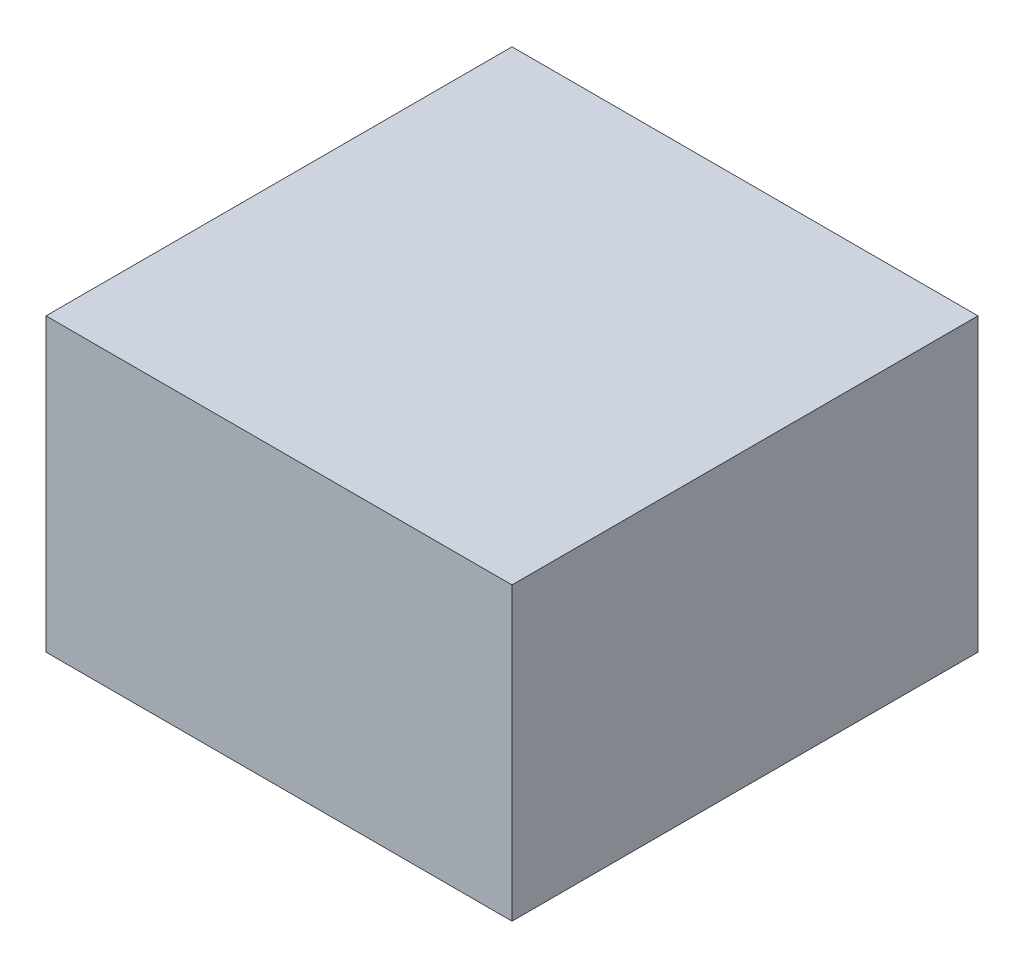
ISO-10303-21;
HEADER;
FILE_DESCRIPTION(('STEP AP214'),'2;1');
FILE_NAME('part.step','',(''),(''),'','','');
FILE_SCHEMA(('AUTOMOTIVE_DESIGN { 1 0 10303 214 1 1 1 1 }'));
ENDSEC;
DATA;
#1=APPLICATION_CONTEXT('core data for automotive mechanical design processes');
#2=APPLICATION_PROTOCOL_DEFINITION('international standard','automotive_design',2000,#1);
#3=PRODUCT_CONTEXT('',#1,'mechanical');
#4=PRODUCT('Part','Part','',(#3));
#5=PRODUCT_RELATED_PRODUCT_CATEGORY('part','',(#4));
#6=PRODUCT_DEFINITION_FORMATION('','',#4);
#7=PRODUCT_DEFINITION_CONTEXT('part definition',#1,'design');
#8=PRODUCT_DEFINITION('design','',#6,#7);
#9=PRODUCT_DEFINITION_SHAPE('','',#8);
#10=(LENGTH_UNIT() NAMED_UNIT(*) SI_UNIT(.MILLI.,.METRE.));
#11=(NAMED_UNIT(*) PLANE_ANGLE_UNIT() SI_UNIT($,.RADIAN.));
#12=(NAMED_UNIT(*) SI_UNIT($,.STERADIAN.) SOLID_ANGLE_UNIT());
#13=UNCERTAINTY_MEASURE_WITH_UNIT(LENGTH_MEASURE(1.E-05),#10,'distance_accuracy_value','');
#14=(GEOMETRIC_REPRESENTATION_CONTEXT(3) GLOBAL_UNCERTAINTY_ASSIGNED_CONTEXT((#13)) GLOBAL_UNIT_ASSIGNED_CONTEXT((#10,
#11,#12)) REPRESENTATION_CONTEXT('',''));
#15=CARTESIAN_POINT('',(0.,0.,0.));
#16=DIRECTION('',(0.,0.,1.));
#17=DIRECTION('',(1.,0.,0.));
#18=AXIS2_PLACEMENT_3D('',#15,#16,#17);
#19=CARTESIAN_POINT('',(101.6,127.,-101.6));
#20=DIRECTION('',(-1.,0.,0.));
#21=DIRECTION('',(0.,0.,1.));
#22=AXIS2_PLACEMENT_3D('',#19,#20,#21);
#23=PLANE('',#22);
#24=DIRECTION('',(0.,0.,-1.));
#25=VECTOR('',#24,1.);
#26=CARTESIAN_POINT('',(101.6,0.,-101.6));
#27=LINE('',#26,#25);
#28=CARTESIAN_POINT('',(101.6,0.,101.6));
#29=VERTEX_POINT('',#28);
#30=CARTESIAN_POINT('',(101.6,0.,-101.6));
#31=VERTEX_POINT('',#30);
#32=EDGE_CURVE('E107',#29,#31,#27,.T.);
#33=ORIENTED_EDGE('',*,*,#32,.T.);
#34=DIRECTION('',(0.,-1.,0.));
#35=VECTOR('',#34,1.);
#36=CARTESIAN_POINT('',(101.6,127.,-101.6));
#37=LINE('',#36,#35);
#38=CARTESIAN_POINT('',(101.6,127.,-101.6));
#39=VERTEX_POINT('',#38);
#40=EDGE_CURVE('E11',#39,#31,#37,.T.);
#41=ORIENTED_EDGE('',*,*,#40,.F.);
#42=DIRECTION('',(0.,0.,-1.));
#43=VECTOR('',#42,1.);
#44=CARTESIAN_POINT('',(101.6,127.,-101.6));
#45=LINE('',#44,#43);
#46=CARTESIAN_POINT('',(101.6,127.,101.6));
#47=VERTEX_POINT('',#46);
#48=EDGE_CURVE('E91',#47,#39,#45,.T.);
#49=ORIENTED_EDGE('',*,*,#48,.F.);
#50=DIRECTION('',(0.,-1.,0.));
#51=VECTOR('',#50,1.);
#52=CARTESIAN_POINT('',(101.6,127.,101.6));
#53=LINE('',#52,#51);
#54=EDGE_CURVE('E103',#47,#29,#53,.T.);
#55=ORIENTED_EDGE('',*,*,#54,.T.);
#56=EDGE_LOOP('',(#33,#41,#49,#55));
#57=FACE_BOUND('',#56,.T.);
#58=ADVANCED_FACE('F39',(#57),#23,.F.);
#59=CARTESIAN_POINT('',(-101.6,127.,-101.6));
#60=DIRECTION('',(0.,0.,1.));
#61=DIRECTION('',(1.,0.,0.));
#62=AXIS2_PLACEMENT_3D('',#59,#60,#61);
#63=PLANE('',#62);
#64=DIRECTION('',(-1.,0.,0.));
#65=VECTOR('',#64,1.);
#66=CARTESIAN_POINT('',(-101.6,0.,-101.6));
#67=LINE('',#66,#65);
#68=CARTESIAN_POINT('',(-101.6,0.,-101.6));
#69=VERTEX_POINT('',#68);
#70=EDGE_CURVE('E96',#31,#69,#67,.T.);
#71=ORIENTED_EDGE('',*,*,#70,.T.);
#72=DIRECTION('',(0.,-1.,0.));
#73=VECTOR('',#72,1.);
#74=CARTESIAN_POINT('',(-101.6,127.,-101.6));
#75=LINE('',#74,#73);
#76=CARTESIAN_POINT('',(-101.6,127.,-101.6));
#77=VERTEX_POINT('',#76);
#78=EDGE_CURVE('E48',#77,#69,#75,.T.);
#79=ORIENTED_EDGE('',*,*,#78,.F.);
#80=DIRECTION('',(-1.,0.,0.));
#81=VECTOR('',#80,1.);
#82=CARTESIAN_POINT('',(-101.6,127.,-101.6));
#83=LINE('',#82,#81);
#84=EDGE_CURVE('E86',#39,#77,#83,.T.);
#85=ORIENTED_EDGE('',*,*,#84,.F.);
#86=ORIENTED_EDGE('',*,*,#40,.T.);
#87=EDGE_LOOP('',(#71,#79,#85,#86));
#88=FACE_BOUND('',#87,.T.);
#89=ADVANCED_FACE('F95',(#88),#63,.F.);
#90=CARTESIAN_POINT('',(-101.6,127.,-101.6));
#91=DIRECTION('',(1.,0.,0.));
#92=DIRECTION('',(0.,0.,-1.));
#93=AXIS2_PLACEMENT_3D('',#90,#91,#92);
#94=PLANE('',#93);
#95=DIRECTION('',(0.,0.,1.));
#96=VECTOR('',#95,1.);
#97=CARTESIAN_POINT('',(-101.6,0.,-101.6));
#98=LINE('',#97,#96);
#99=CARTESIAN_POINT('',(-101.6,0.,101.6));
#100=VERTEX_POINT('',#99);
#101=EDGE_CURVE('E73',#69,#100,#98,.T.);
#102=ORIENTED_EDGE('',*,*,#101,.T.);
#103=DIRECTION('',(0.,-1.,0.));
#104=VECTOR('',#103,1.);
#105=CARTESIAN_POINT('',(-101.6,127.,101.6));
#106=LINE('',#105,#104);
#107=CARTESIAN_POINT('',(-101.6,127.,101.6));
#108=VERTEX_POINT('',#107);
#109=EDGE_CURVE('E98',#108,#100,#106,.T.);
#110=ORIENTED_EDGE('',*,*,#109,.F.);
#111=DIRECTION('',(0.,0.,1.));
#112=VECTOR('',#111,1.);
#113=CARTESIAN_POINT('',(-101.6,127.,-101.6));
#114=LINE('',#113,#112);
#115=EDGE_CURVE('E89',#77,#108,#114,.T.);
#116=ORIENTED_EDGE('',*,*,#115,.F.);
#117=ORIENTED_EDGE('',*,*,#78,.T.);
#118=EDGE_LOOP('',(#102,#110,#116,#117));
#119=FACE_BOUND('',#118,.T.);
#120=ADVANCED_FACE('F99',(#119),#94,.F.);
#121=CARTESIAN_POINT('',(-101.6,127.,101.6));
#122=DIRECTION('',(0.,0.,-1.));
#123=DIRECTION('',(-1.,0.,0.));
#124=AXIS2_PLACEMENT_3D('',#121,#122,#123);
#125=PLANE('',#124);
#126=DIRECTION('',(1.,0.,0.));
#127=VECTOR('',#126,1.);
#128=CARTESIAN_POINT('',(-101.6,0.,101.6));
#129=LINE('',#128,#127);
#130=EDGE_CURVE('E79',#100,#29,#129,.T.);
#131=ORIENTED_EDGE('',*,*,#130,.T.);
#132=ORIENTED_EDGE('',*,*,#54,.F.);
#133=DIRECTION('',(1.,0.,0.));
#134=VECTOR('',#133,1.);
#135=CARTESIAN_POINT('',(-101.6,127.,101.6));
#136=LINE('',#135,#134);
#137=EDGE_CURVE('E56',#108,#47,#136,.T.);
#138=ORIENTED_EDGE('',*,*,#137,.F.);
#139=ORIENTED_EDGE('',*,*,#109,.T.);
#140=EDGE_LOOP('',(#131,#132,#138,#139));
#141=FACE_BOUND('',#140,.T.);
#142=ADVANCED_FACE('F120',(#141),#125,.F.);
#143=CARTESIAN_POINT('',(0.,127.,0.));
#144=DIRECTION('',(0.,1.,0.));
#145=DIRECTION('',(0.,0.,1.));
#146=AXIS2_PLACEMENT_3D('',#143,#144,#145);
#147=PLANE('',#146);
#148=ORIENTED_EDGE('',*,*,#48,.T.);
#149=ORIENTED_EDGE('',*,*,#84,.T.);
#150=ORIENTED_EDGE('',*,*,#115,.T.);
#151=ORIENTED_EDGE('',*,*,#137,.T.);
#152=EDGE_LOOP('',(#148,#149,#150,#151));
#153=FACE_BOUND('',#152,.T.);
#154=ADVANCED_FACE('F87',(#153),#147,.T.);
#155=CARTESIAN_POINT('',(0.,0.,0.));
#156=DIRECTION('',(0.,1.,0.));
#157=DIRECTION('',(0.,0.,1.));
#158=AXIS2_PLACEMENT_3D('',#155,#156,#157);
#159=PLANE('',#158);
#160=ORIENTED_EDGE('',*,*,#32,.F.);
#161=ORIENTED_EDGE('',*,*,#130,.F.);
#162=ORIENTED_EDGE('',*,*,#101,.F.);
#163=ORIENTED_EDGE('',*,*,#70,.F.);
#164=EDGE_LOOP('',(#160,#161,#162,#163));
#165=FACE_BOUND('',#164,.T.);
#166=ADVANCED_FACE('F123',(#165),#159,.F.);
#167=CLOSED_SHELL('',(#58,#89,#120,#142,#154,#166));
#168=MANIFOLD_SOLID_BREP('B2',#167);
#169=ADVANCED_BREP_SHAPE_REPRESENTATION('',(#18,#168),#14);
#170=SHAPE_DEFINITION_REPRESENTATION(#9,#169);
ENDSEC;
END-ISO-10303-21;
